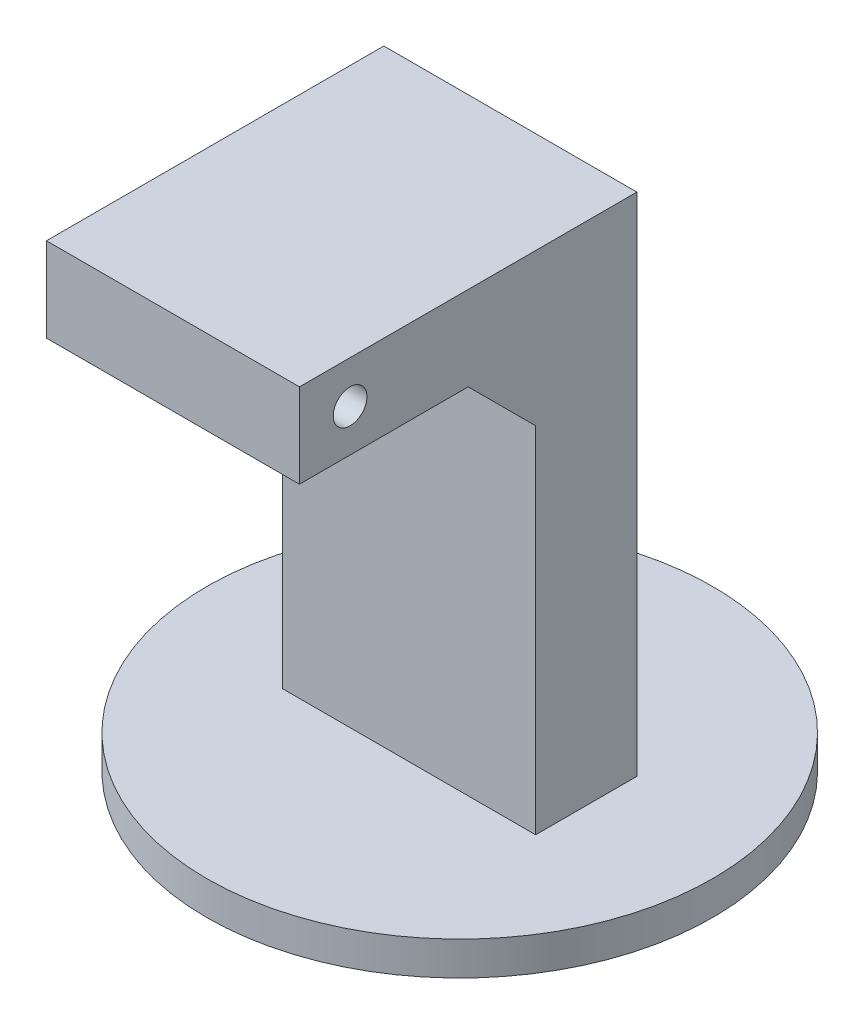
ISO-10303-21;
HEADER;
FILE_DESCRIPTION(('STEP AP214'),'2;1');
FILE_NAME('part.step','',(''),(''),'','','');
FILE_SCHEMA(('AUTOMOTIVE_DESIGN { 1 0 10303 214 1 1 1 1 }'));
ENDSEC;
DATA;
#1=APPLICATION_CONTEXT('core data for automotive mechanical design processes');
#2=APPLICATION_PROTOCOL_DEFINITION('international standard','automotive_design',2000,#1);
#3=PRODUCT_CONTEXT('',#1,'mechanical');
#4=PRODUCT('Part','Part','',(#3));
#5=PRODUCT_RELATED_PRODUCT_CATEGORY('part','',(#4));
#6=PRODUCT_DEFINITION_FORMATION('','',#4);
#7=PRODUCT_DEFINITION_CONTEXT('part definition',#1,'design');
#8=PRODUCT_DEFINITION('design','',#6,#7);
#9=PRODUCT_DEFINITION_SHAPE('','',#8);
#10=(LENGTH_UNIT() NAMED_UNIT(*) SI_UNIT(.MILLI.,.METRE.));
#11=(NAMED_UNIT(*) PLANE_ANGLE_UNIT() SI_UNIT($,.RADIAN.));
#12=(NAMED_UNIT(*) SI_UNIT($,.STERADIAN.) SOLID_ANGLE_UNIT());
#13=UNCERTAINTY_MEASURE_WITH_UNIT(LENGTH_MEASURE(1.E-05),#10,'distance_accuracy_value','');
#14=(GEOMETRIC_REPRESENTATION_CONTEXT(3) GLOBAL_UNCERTAINTY_ASSIGNED_CONTEXT((#13)) GLOBAL_UNIT_ASSIGNED_CONTEXT((#10,
#11,#12)) REPRESENTATION_CONTEXT('',''));
#15=CARTESIAN_POINT('',(0.,0.,0.));
#16=DIRECTION('',(0.,0.,1.));
#17=DIRECTION('',(1.,0.,0.));
#18=AXIS2_PLACEMENT_3D('',#15,#16,#17);
#19=CARTESIAN_POINT('',(0.,2.,0.));
#20=DIRECTION('',(0.,-1.,0.));
#21=DIRECTION('',(0.,0.,-1.));
#22=AXIS2_PLACEMENT_3D('',#19,#20,#21);
#23=CYLINDRICAL_SURFACE('',#22,15.);
#24=CARTESIAN_POINT('',(0.,2.,0.));
#25=DIRECTION('',(0.,1.,0.));
#26=DIRECTION('',(0.,0.,1.));
#27=AXIS2_PLACEMENT_3D('',#24,#25,#26);
#28=CIRCLE('',#27,15.);
#29=CARTESIAN_POINT('',(0.,2.,15.));
#30=VERTEX_POINT('',#29);
#31=EDGE_CURVE('E142',#30,#30,#28,.T.);
#32=ORIENTED_EDGE('',*,*,#31,.F.);
#33=EDGE_LOOP('',(#32));
#34=FACE_BOUND('',#33,.T.);
#35=CARTESIAN_POINT('',(0.,0.,0.));
#36=DIRECTION('',(0.,1.,0.));
#37=DIRECTION('',(0.,0.,1.));
#38=AXIS2_PLACEMENT_3D('',#35,#36,#37);
#39=CIRCLE('',#38,15.);
#40=CARTESIAN_POINT('',(0.,0.,15.));
#41=VERTEX_POINT('',#40);
#42=EDGE_CURVE('E141',#41,#41,#39,.T.);
#43=ORIENTED_EDGE('',*,*,#42,.T.);
#44=EDGE_LOOP('',(#43));
#45=FACE_BOUND('',#44,.T.);
#46=ADVANCED_FACE('F33',(#34,#45),#23,.T.);
#47=CARTESIAN_POINT('',(0.,2.,0.));
#48=DIRECTION('',(0.,1.,0.));
#49=DIRECTION('',(0.,0.,1.));
#50=AXIS2_PLACEMENT_3D('',#47,#48,#49);
#51=PLANE('',#50);
#52=DIRECTION('',(0.,0.,1.));
#53=VECTOR('',#52,1.);
#54=CARTESIAN_POINT('',(-7.5,2.,3.));
#55=LINE('',#54,#53);
#56=CARTESIAN_POINT('',(-7.5,2.,-3.));
#57=VERTEX_POINT('',#56);
#58=CARTESIAN_POINT('',(-7.5,2.,3.));
#59=VERTEX_POINT('',#58);
#60=EDGE_CURVE('E117',#57,#59,#55,.T.);
#61=ORIENTED_EDGE('',*,*,#60,.F.);
#62=DIRECTION('',(-1.,0.,0.));
#63=VECTOR('',#62,1.);
#64=CARTESIAN_POINT('',(7.5,2.,-3.));
#65=LINE('',#64,#63);
#66=CARTESIAN_POINT('',(7.5,2.,-3.));
#67=VERTEX_POINT('',#66);
#68=EDGE_CURVE('E129',#67,#57,#65,.T.);
#69=ORIENTED_EDGE('',*,*,#68,.F.);
#70=DIRECTION('',(0.,0.,-1.));
#71=VECTOR('',#70,1.);
#72=CARTESIAN_POINT('',(7.5,2.,3.));
#73=LINE('',#72,#71);
#74=CARTESIAN_POINT('',(7.5,2.,3.));
#75=VERTEX_POINT('',#74);
#76=EDGE_CURVE('E126',#75,#67,#73,.T.);
#77=ORIENTED_EDGE('',*,*,#76,.F.);
#78=DIRECTION('',(1.,0.,0.));
#79=VECTOR('',#78,1.);
#80=CARTESIAN_POINT('',(7.5,2.,3.));
#81=LINE('',#80,#79);
#82=EDGE_CURVE('E119',#59,#75,#81,.T.);
#83=ORIENTED_EDGE('',*,*,#82,.F.);
#84=EDGE_LOOP('',(#61,#69,#77,#83));
#85=FACE_BOUND('',#84,.T.);
#86=ORIENTED_EDGE('',*,*,#31,.T.);
#87=EDGE_LOOP('',(#86));
#88=FACE_BOUND('',#87,.T.);
#89=ADVANCED_FACE('F184',(#85,#88),#51,.T.);
#90=CARTESIAN_POINT('',(0.,0.,0.));
#91=DIRECTION('',(0.,1.,0.));
#92=DIRECTION('',(0.,0.,1.));
#93=AXIS2_PLACEMENT_3D('',#90,#91,#92);
#94=PLANE('',#93);
#95=ORIENTED_EDGE('',*,*,#42,.F.);
#96=EDGE_LOOP('',(#95));
#97=FACE_BOUND('',#96,.T.);
#98=ADVANCED_FACE('F189',(#97),#94,.F.);
#99=CARTESIAN_POINT('',(-7.5,27.,3.));
#100=DIRECTION('',(1.,0.,0.));
#101=DIRECTION('',(0.,0.,-1.));
#102=AXIS2_PLACEMENT_3D('',#99,#100,#101);
#103=PLANE('',#102);
#104=CARTESIAN_POINT('',(-7.5,29.5,14.));
#105=DIRECTION('',(1.,0.,0.));
#106=DIRECTION('',(0.,0.,-1.));
#107=AXIS2_PLACEMENT_3D('',#104,#105,#106);
#108=CIRCLE('',#107,1.);
#109=CARTESIAN_POINT('',(-7.5,29.5,13.));
#110=VERTEX_POINT('',#109);
#111=EDGE_CURVE('E161',#110,#110,#108,.F.);
#112=ORIENTED_EDGE('',*,*,#111,.F.);
#113=EDGE_LOOP('',(#112));
#114=FACE_BOUND('',#113,.T.);
#115=ORIENTED_EDGE('',*,*,#60,.T.);
#116=DIRECTION('',(0.,-1.,0.));
#117=VECTOR('',#116,1.);
#118=CARTESIAN_POINT('',(-7.5,27.,3.));
#119=LINE('',#118,#117);
#120=CARTESIAN_POINT('',(-7.5,23.,3.));
#121=VERTEX_POINT('',#120);
#122=EDGE_CURVE('E139',#121,#59,#119,.T.);
#123=ORIENTED_EDGE('',*,*,#122,.F.);
#124=DIRECTION('',(0.,-0.707106781186544,-0.707106781186551));
#125=VECTOR('',#124,1.);
#126=CARTESIAN_POINT('',(-7.5,25.,5.));
#127=LINE('',#126,#125);
#128=CARTESIAN_POINT('',(-7.5,27.,7.00000000000003));
#129=VERTEX_POINT('',#128);
#130=EDGE_CURVE('E11',#121,#129,#127,.F.);
#131=ORIENTED_EDGE('',*,*,#130,.T.);
#132=DIRECTION('',(0.,0.,1.));
#133=VECTOR('',#132,1.);
#134=CARTESIAN_POINT('',(-7.5,27.,-3.));
#135=LINE('',#134,#133);
#136=CARTESIAN_POINT('',(-7.5,27.,17.));
#137=VERTEX_POINT('',#136);
#138=EDGE_CURVE('E115',#129,#137,#135,.T.);
#139=ORIENTED_EDGE('',*,*,#138,.T.);
#140=DIRECTION('',(0.,-1.,0.));
#141=VECTOR('',#140,1.);
#142=CARTESIAN_POINT('',(-7.5,32.,17.));
#143=LINE('',#142,#141);
#144=CARTESIAN_POINT('',(-7.5,32.,17.));
#145=VERTEX_POINT('',#144);
#146=EDGE_CURVE('E94',#145,#137,#143,.T.);
#147=ORIENTED_EDGE('',*,*,#146,.F.);
#148=DIRECTION('',(0.,0.,1.));
#149=VECTOR('',#148,1.);
#150=CARTESIAN_POINT('',(-7.5,32.,-3.));
#151=LINE('',#150,#149);
#152=CARTESIAN_POINT('',(-7.5,32.,-3.));
#153=VERTEX_POINT('',#152);
#154=EDGE_CURVE('E101',#153,#145,#151,.T.);
#155=ORIENTED_EDGE('',*,*,#154,.F.);
#156=DIRECTION('',(0.,-1.,0.));
#157=VECTOR('',#156,1.);
#158=CARTESIAN_POINT('',(-7.5,27.,-3.));
#159=LINE('',#158,#157);
#160=EDGE_CURVE('E132',#153,#57,#159,.T.);
#161=ORIENTED_EDGE('',*,*,#160,.T.);
#162=EDGE_LOOP('',(#115,#123,#131,#139,#147,#155,#161));
#163=FACE_BOUND('',#162,.T.);
#164=ADVANCED_FACE('F113',(#114,#163),#103,.F.);
#165=CARTESIAN_POINT('',(7.5,27.,3.));
#166=DIRECTION('',(0.,0.,-1.));
#167=DIRECTION('',(-1.,0.,0.));
#168=AXIS2_PLACEMENT_3D('',#165,#166,#167);
#169=PLANE('',#168);
#170=DIRECTION('',(0.,-1.,0.));
#171=VECTOR('',#170,1.);
#172=CARTESIAN_POINT('',(7.5,27.,3.));
#173=LINE('',#172,#171);
#174=CARTESIAN_POINT('',(7.5,23.,3.));
#175=VERTEX_POINT('',#174);
#176=EDGE_CURVE('E137',#175,#75,#173,.T.);
#177=ORIENTED_EDGE('',*,*,#176,.F.);
#178=DIRECTION('',(-1.,0.,0.));
#179=VECTOR('',#178,1.);
#180=CARTESIAN_POINT('',(-7.5,23.,3.));
#181=LINE('',#180,#179);
#182=EDGE_CURVE('E48',#175,#121,#181,.T.);
#183=ORIENTED_EDGE('',*,*,#182,.T.);
#184=ORIENTED_EDGE('',*,*,#122,.T.);
#185=ORIENTED_EDGE('',*,*,#82,.T.);
#186=EDGE_LOOP('',(#177,#183,#184,#185));
#187=FACE_BOUND('',#186,.T.);
#188=ADVANCED_FACE('F174',(#187),#169,.F.);
#189=CARTESIAN_POINT('',(7.5,27.,3.));
#190=DIRECTION('',(-1.,0.,0.));
#191=DIRECTION('',(0.,0.,1.));
#192=AXIS2_PLACEMENT_3D('',#189,#190,#191);
#193=PLANE('',#192);
#194=CARTESIAN_POINT('',(7.5,29.5,14.));
#195=DIRECTION('',(1.,0.,0.));
#196=DIRECTION('',(0.,0.,-1.));
#197=AXIS2_PLACEMENT_3D('',#194,#195,#196);
#198=CIRCLE('',#197,1.);
#199=CARTESIAN_POINT('',(7.5,29.5,13.));
#200=VERTEX_POINT('',#199);
#201=EDGE_CURVE('E166',#200,#200,#198,.T.);
#202=ORIENTED_EDGE('',*,*,#201,.F.);
#203=EDGE_LOOP('',(#202));
#204=FACE_BOUND('',#203,.T.);
#205=ORIENTED_EDGE('',*,*,#76,.T.);
#206=DIRECTION('',(0.,-1.,0.));
#207=VECTOR('',#206,1.);
#208=CARTESIAN_POINT('',(7.5,27.,-3.));
#209=LINE('',#208,#207);
#210=CARTESIAN_POINT('',(7.5,32.,-3.));
#211=VERTEX_POINT('',#210);
#212=EDGE_CURVE('E134',#211,#67,#209,.T.);
#213=ORIENTED_EDGE('',*,*,#212,.F.);
#214=DIRECTION('',(0.,0.,-1.));
#215=VECTOR('',#214,1.);
#216=CARTESIAN_POINT('',(7.5,32.,-3.));
#217=LINE('',#216,#215);
#218=CARTESIAN_POINT('',(7.5,32.,17.));
#219=VERTEX_POINT('',#218);
#220=EDGE_CURVE('E100',#219,#211,#217,.T.);
#221=ORIENTED_EDGE('',*,*,#220,.F.);
#222=DIRECTION('',(0.,-1.,0.));
#223=VECTOR('',#222,1.);
#224=CARTESIAN_POINT('',(7.5,32.,17.));
#225=LINE('',#224,#223);
#226=CARTESIAN_POINT('',(7.5,27.,17.));
#227=VERTEX_POINT('',#226);
#228=EDGE_CURVE('E96',#219,#227,#225,.T.);
#229=ORIENTED_EDGE('',*,*,#228,.T.);
#230=DIRECTION('',(0.,0.,-1.));
#231=VECTOR('',#230,1.);
#232=CARTESIAN_POINT('',(7.5,27.,-3.));
#233=LINE('',#232,#231);
#234=CARTESIAN_POINT('',(7.5,27.,7.00000000000003));
#235=VERTEX_POINT('',#234);
#236=EDGE_CURVE('E110',#227,#235,#233,.T.);
#237=ORIENTED_EDGE('',*,*,#236,.T.);
#238=DIRECTION('',(0.,0.707106781186544,0.707106781186551));
#239=VECTOR('',#238,1.);
#240=CARTESIAN_POINT('',(7.5,25.,5.));
#241=LINE('',#240,#239);
#242=EDGE_CURVE('E41',#235,#175,#241,.F.);
#243=ORIENTED_EDGE('',*,*,#242,.T.);
#244=ORIENTED_EDGE('',*,*,#176,.T.);
#245=EDGE_LOOP('',(#205,#213,#221,#229,#237,#243,#244));
#246=FACE_BOUND('',#245,.T.);
#247=ADVANCED_FACE('F156',(#204,#246),#193,.F.);
#248=CARTESIAN_POINT('',(7.5,27.,-3.));
#249=DIRECTION('',(0.,0.,1.));
#250=DIRECTION('',(1.,0.,0.));
#251=AXIS2_PLACEMENT_3D('',#248,#249,#250);
#252=PLANE('',#251);
#253=ORIENTED_EDGE('',*,*,#68,.T.);
#254=ORIENTED_EDGE('',*,*,#160,.F.);
#255=DIRECTION('',(-1.,0.,0.));
#256=VECTOR('',#255,1.);
#257=CARTESIAN_POINT('',(-7.5,32.,-3.));
#258=LINE('',#257,#256);
#259=EDGE_CURVE('E107',#211,#153,#258,.T.);
#260=ORIENTED_EDGE('',*,*,#259,.F.);
#261=ORIENTED_EDGE('',*,*,#212,.T.);
#262=EDGE_LOOP('',(#253,#254,#260,#261));
#263=FACE_BOUND('',#262,.T.);
#264=ADVANCED_FACE('F173',(#263),#252,.F.);
#265=CARTESIAN_POINT('',(0.,27.,0.));
#266=DIRECTION('',(0.,1.,0.));
#267=DIRECTION('',(0.,0.,1.));
#268=AXIS2_PLACEMENT_3D('',#265,#266,#267);
#269=PLANE('',#268);
#270=ORIENTED_EDGE('',*,*,#138,.F.);
#271=DIRECTION('',(1.,0.,0.));
#272=VECTOR('',#271,1.);
#273=CARTESIAN_POINT('',(7.5,27.,7.00000000000003));
#274=LINE('',#273,#272);
#275=EDGE_CURVE('E145',#129,#235,#274,.T.);
#276=ORIENTED_EDGE('',*,*,#275,.T.);
#277=ORIENTED_EDGE('',*,*,#236,.F.);
#278=DIRECTION('',(1.,0.,0.));
#279=VECTOR('',#278,1.);
#280=CARTESIAN_POINT('',(-7.5,27.,17.));
#281=LINE('',#280,#279);
#282=EDGE_CURVE('E157',#137,#227,#281,.T.);
#283=ORIENTED_EDGE('',*,*,#282,.F.);
#284=EDGE_LOOP('',(#270,#276,#277,#283));
#285=FACE_BOUND('',#284,.T.);
#286=ADVANCED_FACE('F153',(#285),#269,.F.);
#287=CARTESIAN_POINT('',(-7.5,32.,17.));
#288=DIRECTION('',(0.,0.,-1.));
#289=DIRECTION('',(-1.,0.,0.));
#290=AXIS2_PLACEMENT_3D('',#287,#288,#289);
#291=PLANE('',#290);
#292=ORIENTED_EDGE('',*,*,#282,.T.);
#293=ORIENTED_EDGE('',*,*,#228,.F.);
#294=DIRECTION('',(1.,0.,0.));
#295=VECTOR('',#294,1.);
#296=CARTESIAN_POINT('',(-7.5,32.,17.));
#297=LINE('',#296,#295);
#298=EDGE_CURVE('E90',#145,#219,#297,.T.);
#299=ORIENTED_EDGE('',*,*,#298,.F.);
#300=ORIENTED_EDGE('',*,*,#146,.T.);
#301=EDGE_LOOP('',(#292,#293,#299,#300));
#302=FACE_BOUND('',#301,.T.);
#303=ADVANCED_FACE('F92',(#302),#291,.F.);
#304=CARTESIAN_POINT('',(0.,32.,0.));
#305=DIRECTION('',(0.,1.,0.));
#306=DIRECTION('',(0.,0.,1.));
#307=AXIS2_PLACEMENT_3D('',#304,#305,#306);
#308=PLANE('',#307);
#309=ORIENTED_EDGE('',*,*,#154,.T.);
#310=ORIENTED_EDGE('',*,*,#298,.T.);
#311=ORIENTED_EDGE('',*,*,#220,.T.);
#312=ORIENTED_EDGE('',*,*,#259,.T.);
#313=EDGE_LOOP('',(#309,#310,#311,#312));
#314=FACE_BOUND('',#313,.T.);
#315=ADVANCED_FACE('F105',(#314),#308,.T.);
#316=CARTESIAN_POINT('',(0.,27.,7.00000000000003));
#317=DIRECTION('',(0.,-0.707106781186551,0.707106781186544));
#318=DIRECTION('',(-1.,0.,0.));
#319=AXIS2_PLACEMENT_3D('',#316,#317,#318);
#320=PLANE('',#319);
#321=ORIENTED_EDGE('',*,*,#130,.F.);
#322=ORIENTED_EDGE('',*,*,#182,.F.);
#323=ORIENTED_EDGE('',*,*,#242,.F.);
#324=ORIENTED_EDGE('',*,*,#275,.F.);
#325=EDGE_LOOP('',(#321,#322,#323,#324));
#326=FACE_BOUND('',#325,.T.);
#327=ADVANCED_FACE('F35',(#326),#320,.T.);
#328=CARTESIAN_POINT('',(-10.3284271247462,29.5,14.));
#329=DIRECTION('',(1.,0.,0.));
#330=DIRECTION('',(0.,0.,-1.));
#331=AXIS2_PLACEMENT_3D('',#328,#329,#330);
#332=CYLINDRICAL_SURFACE('',#331,1.);
#333=ORIENTED_EDGE('',*,*,#111,.T.);
#334=EDGE_LOOP('',(#333));
#335=FACE_BOUND('',#334,.T.);
#336=ORIENTED_EDGE('',*,*,#201,.T.);
#337=EDGE_LOOP('',(#336));
#338=FACE_BOUND('',#337,.T.);
#339=ADVANCED_FACE('F170',(#335,#338),#332,.F.);
#340=CLOSED_SHELL('',(#46,#89,#98,#164,#188,#247,#264,#286,#303,#315,#327,#339));
#341=MANIFOLD_SOLID_BREP('B2',#340);
#342=ADVANCED_BREP_SHAPE_REPRESENTATION('',(#18,#341),#14);
#343=SHAPE_DEFINITION_REPRESENTATION(#9,#342);
ENDSEC;
END-ISO-10303-21;
